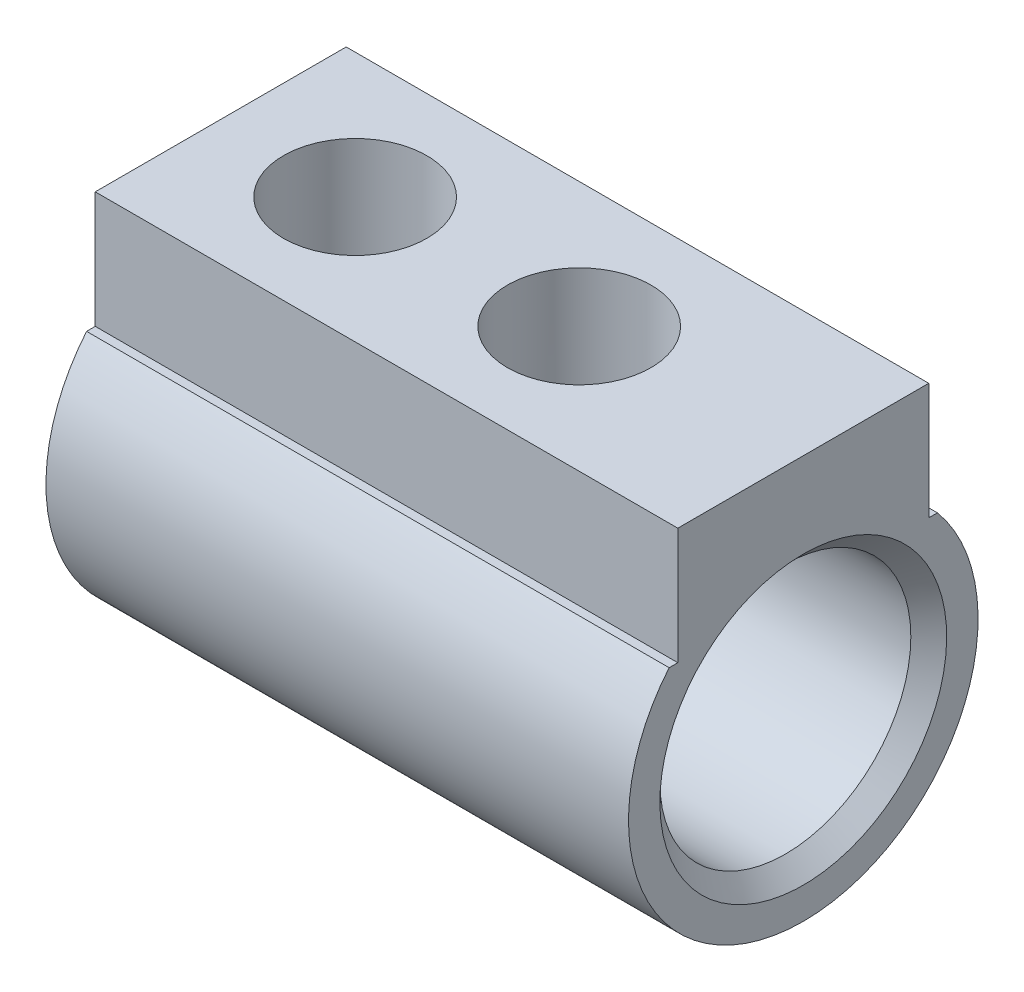
ISO-10303-21;
HEADER;
FILE_DESCRIPTION(('STEP AP214'),'2;1');
FILE_NAME('part.step','',(''),(''),'','','');
FILE_SCHEMA(('AUTOMOTIVE_DESIGN { 1 0 10303 214 1 1 1 1 }'));
ENDSEC;
DATA;
#1=APPLICATION_CONTEXT('core data for automotive mechanical design processes');
#2=APPLICATION_PROTOCOL_DEFINITION('international standard','automotive_design',2000,#1);
#3=PRODUCT_CONTEXT('',#1,'mechanical');
#4=PRODUCT('Part','Part','',(#3));
#5=PRODUCT_RELATED_PRODUCT_CATEGORY('part','',(#4));
#6=PRODUCT_DEFINITION_FORMATION('','',#4);
#7=PRODUCT_DEFINITION_CONTEXT('part definition',#1,'design');
#8=PRODUCT_DEFINITION('design','',#6,#7);
#9=PRODUCT_DEFINITION_SHAPE('','',#8);
#10=(LENGTH_UNIT() NAMED_UNIT(*) SI_UNIT(.MILLI.,.METRE.));
#11=(NAMED_UNIT(*) PLANE_ANGLE_UNIT() SI_UNIT($,.RADIAN.));
#12=(NAMED_UNIT(*) SI_UNIT($,.STERADIAN.) SOLID_ANGLE_UNIT());
#13=UNCERTAINTY_MEASURE_WITH_UNIT(LENGTH_MEASURE(1.E-05),#10,'distance_accuracy_value','');
#14=(GEOMETRIC_REPRESENTATION_CONTEXT(3) GLOBAL_UNCERTAINTY_ASSIGNED_CONTEXT((#13)) GLOBAL_UNIT_ASSIGNED_CONTEXT((#10,
#11,#12)) REPRESENTATION_CONTEXT('',''));
#15=CARTESIAN_POINT('',(0.,0.,0.));
#16=DIRECTION('',(0.,0.,1.));
#17=DIRECTION('',(1.,0.,0.));
#18=AXIS2_PLACEMENT_3D('',#15,#16,#17);
#19=CARTESIAN_POINT('',(2.5,0.,0.));
#20=DIRECTION('',(1.,0.,0.));
#21=DIRECTION('',(0.,0.,-1.));
#22=AXIS2_PLACEMENT_3D('',#19,#20,#21);
#23=PLANE('',#22);
#24=CARTESIAN_POINT('',(2.5,0.,0.));
#25=DIRECTION('',(-1.,0.,0.));
#26=DIRECTION('',(0.,0.,1.));
#27=AXIS2_PLACEMENT_3D('',#24,#25,#26);
#28=CIRCLE('',#27,1.2);
#29=CARTESIAN_POINT('',(2.5,0.,-1.2));
#30=VERTEX_POINT('',#29);
#31=CARTESIAN_POINT('',(2.5,0.,1.2));
#32=VERTEX_POINT('',#31);
#33=EDGE_CURVE('E84',#30,#32,#28,.F.);
#34=ORIENTED_EDGE('',*,*,#33,.T.);
#35=CARTESIAN_POINT('',(2.5,0.,0.));
#36=DIRECTION('',(-1.,0.,0.));
#37=DIRECTION('',(0.,0.,-1.));
#38=AXIS2_PLACEMENT_3D('',#35,#36,#37);
#39=CIRCLE('',#38,1.2);
#40=EDGE_CURVE('E81',#32,#30,#39,.F.);
#41=ORIENTED_EDGE('',*,*,#40,.T.);
#42=EDGE_LOOP('',(#34,#41));
#43=FACE_BOUND('',#42,.T.);
#44=ADVANCED_FACE('F16',(#43),#23,.T.);
#45=CARTESIAN_POINT('',(2.70000000000003,0.,0.));
#46=DIRECTION('',(-1.,0.,0.));
#47=DIRECTION('',(0.,0.,1.));
#48=AXIS2_PLACEMENT_3D('',#45,#46,#47);
#49=TOROIDAL_SURFACE('',#48,1.19999999999997,0.200000000000032);
#50=CARTESIAN_POINT('',(2.7,0.,0.));
#51=DIRECTION('',(-1.,0.,0.));
#52=DIRECTION('',(0.,0.,1.));
#53=AXIS2_PLACEMENT_3D('',#50,#51,#52);
#54=CIRCLE('',#53,1.4);
#55=CARTESIAN_POINT('',(2.7,0.,1.4));
#56=VERTEX_POINT('',#55);
#57=EDGE_CURVE('E88',#56,#56,#54,.F.);
#58=ORIENTED_EDGE('',*,*,#57,.T.);
#59=EDGE_LOOP('',(#58));
#60=FACE_BOUND('',#59,.T.);
#61=ORIENTED_EDGE('',*,*,#40,.F.);
#62=ORIENTED_EDGE('',*,*,#33,.F.);
#63=EDGE_LOOP('',(#61,#62));
#64=FACE_BOUND('',#63,.T.);
#65=ADVANCED_FACE('F91',(#60,#64),#49,.F.);
#66=CARTESIAN_POINT('',(6.5,0.,0.));
#67=DIRECTION('',(-1.,0.,0.));
#68=DIRECTION('',(0.,0.,1.));
#69=AXIS2_PLACEMENT_3D('',#66,#67,#68);
#70=CYLINDRICAL_SURFACE('',#69,1.4);
#71=CARTESIAN_POINT('',(6.30000000006703,0.,0.));
#72=DIRECTION('',(1.,0.,0.));
#73=DIRECTION('',(0.,0.,-1.));
#74=AXIS2_PLACEMENT_3D('',#71,#72,#73);
#75=CIRCLE('',#74,1.39999999993279);
#76=CARTESIAN_POINT('',(6.30000000006703,0.,-1.39999999993279));
#77=VERTEX_POINT('',#76);
#78=EDGE_CURVE('E184',#77,#77,#75,.T.);
#79=ORIENTED_EDGE('',*,*,#78,.T.);
#80=EDGE_LOOP('',(#79));
#81=FACE_BOUND('',#80,.T.);
#82=CARTESIAN_POINT('',(4.,1.14891252930761,0.799999999999994));
#83=CARTESIAN_POINT('',(4.04069824257391,1.14891484577563,0.799998460221337));
#84=CARTESIAN_POINT('',(4.08140806043848,1.15110830521368,0.796874222358561));
#85=CARTESIAN_POINT('',(4.16149049705016,1.15951924830011,0.784580899012323));
#86=CARTESIAN_POINT('',(4.20086149011939,1.16574145227915,0.775404722461637));
#87=CARTESIAN_POINT('',(4.27695138583307,1.18123642159114,0.751584111633495));
#88=CARTESIAN_POINT('',(4.31368579621984,1.19048919396833,0.736975432821264));
#89=CARTESIAN_POINT('',(4.38416684446136,1.21096834505556,0.70281680682157));
#90=CARTESIAN_POINT('',(4.4179125539945,1.22219533376744,0.68326533156804));
#91=CARTESIAN_POINT('',(4.48552773454469,1.2468517275537,0.637270069169196));
#92=CARTESIAN_POINT('',(4.51900405412647,1.26038760849784,0.610305254923101));
#93=CARTESIAN_POINT('',(4.58127919704216,1.28728254963199,0.551321521850115));
#94=CARTESIAN_POINT('',(4.61007497979492,1.30064148974336,0.519299344063282));
#95=CARTESIAN_POINT('',(4.66486681857898,1.32718495238073,0.447416658839746));
#96=CARTESIAN_POINT('',(4.69033814634315,1.34023271058415,0.407100750117686));
#97=CARTESIAN_POINT('',(4.73395233092827,1.36321016187439,0.32186882754837));
#98=CARTESIAN_POINT('',(4.7521012386676,1.37314242794682,0.276956650488885));
#99=CARTESIAN_POINT('',(4.77885523829167,1.38798534454052,0.188006517665602));
#100=CARTESIAN_POINT('',(4.78816225404409,1.39326232890506,0.14424233472889));
#101=CARTESIAN_POINT('',(4.79932280103676,1.39960515858208,0.05548549756934));
#102=CARTESIAN_POINT('',(4.80118251388847,1.40067449642611,0.0104938934121116));
#103=CARTESIAN_POINT('',(4.79756523928601,1.39861004047328,-0.0739788056378351));
#104=CARTESIAN_POINT('',(4.79289209299124,1.3959367103426,-0.113509070937489));
#105=CARTESIAN_POINT('',(4.77784217937567,1.38744363636413,-0.191111751803173));
#106=CARTESIAN_POINT('',(4.7674649982232,1.38162366422579,-0.229184061379111));
#107=CARTESIAN_POINT('',(4.74133959140838,1.36728362549718,-0.30327143515931));
#108=CARTESIAN_POINT('',(4.72554447461413,1.35874003371766,-0.339265221191029));
#109=CARTESIAN_POINT('',(4.68915281796566,1.33966105396097,-0.408151377018276));
#110=CARTESIAN_POINT('',(4.66855487179815,1.3291250827676,-0.441042834453448));
#111=CARTESIAN_POINT('',(4.62050207947206,1.30557843194866,-0.506771084917169));
#112=CARTESIAN_POINT('',(4.59253536111841,1.29242264164193,-0.539181513640782));
#113=CARTESIAN_POINT('',(4.53186716749769,1.26575660386133,-0.599115002810966));
#114=CARTESIAN_POINT('',(4.49915979934393,1.25224593262172,-0.626631884086079));
#115=CARTESIAN_POINT('',(4.42604334088809,1.22484715250961,-0.678748311801367));
#116=CARTESIAN_POINT('',(4.38519143329233,1.21105584767092,-0.702782981736945));
#117=CARTESIAN_POINT('',(4.29915613703159,1.18651199116607,-0.743477175319416));
#118=CARTESIAN_POINT('',(4.25398174104994,1.17575330682022,-0.760151622324447));
#119=CARTESIAN_POINT('',(4.17381716778247,1.1615192404806,-0.78165754759861));
#120=CARTESIAN_POINT('',(4.13957666950964,1.15684327359221,-0.788507290996708));
#121=CARTESIAN_POINT('',(4.07022657851125,1.15053996382207,-0.797677628661532));
#122=CARTESIAN_POINT('',(4.03511759849099,1.14891053047944,-0.800001328640378));
#123=CARTESIAN_POINT('',(3.95930175742609,1.14891484577563,-0.799998460221337));
#124=CARTESIAN_POINT('',(3.91859193956152,1.15110830521368,-0.796874222358561));
#125=CARTESIAN_POINT('',(3.83850950294984,1.15951924830011,-0.784580899012323));
#126=CARTESIAN_POINT('',(3.79913850988061,1.16574145227915,-0.775404722461637));
#127=CARTESIAN_POINT('',(3.72304861416693,1.18123642159114,-0.751584111633495));
#128=CARTESIAN_POINT('',(3.68631420378017,1.19048919396833,-0.736975432821264));
#129=CARTESIAN_POINT('',(3.61583315553864,1.21096834505556,-0.70281680682157));
#130=CARTESIAN_POINT('',(3.5820874460055,1.22219533376744,-0.683265331568039));
#131=CARTESIAN_POINT('',(3.51447226545531,1.2468517275537,-0.637270069169196));
#132=CARTESIAN_POINT('',(3.48099594587353,1.26038760849784,-0.6103052549231));
#133=CARTESIAN_POINT('',(3.41872080295784,1.28728254963199,-0.551321521850115));
#134=CARTESIAN_POINT('',(3.38992502020508,1.30064148974336,-0.519299344063281));
#135=CARTESIAN_POINT('',(3.33513318142102,1.32718495238073,-0.447416658839745));
#136=CARTESIAN_POINT('',(3.30966185365685,1.34023271058415,-0.407100750117685));
#137=CARTESIAN_POINT('',(3.26604766907173,1.36321016187439,-0.321868827548369));
#138=CARTESIAN_POINT('',(3.2478987613324,1.37314242794682,-0.276956650488884));
#139=CARTESIAN_POINT('',(3.22114476170833,1.38798534454052,-0.188006517665601));
#140=CARTESIAN_POINT('',(3.21183774595591,1.39326232890506,-0.144242334728889));
#141=CARTESIAN_POINT('',(3.20067719896324,1.39960515858208,-0.0554854975693392));
#142=CARTESIAN_POINT('',(3.19881748611153,1.40067449642611,-0.0104938934121107));
#143=CARTESIAN_POINT('',(3.20243476071399,1.39861004047328,0.0739788056378359));
#144=CARTESIAN_POINT('',(3.20710790700876,1.3959367103426,0.11350907093749));
#145=CARTESIAN_POINT('',(3.22215782062433,1.38744363636413,0.191111751803174));
#146=CARTESIAN_POINT('',(3.2325350017768,1.38162366422578,0.229184061379111));
#147=CARTESIAN_POINT('',(3.25866040859162,1.36728362549718,0.30327143515931));
#148=CARTESIAN_POINT('',(3.27445552538587,1.35874003371766,0.33926522119103));
#149=CARTESIAN_POINT('',(3.31084718203434,1.33966105396097,0.408151377018276));
#150=CARTESIAN_POINT('',(3.33144512820185,1.3291250827676,0.441042834453448));
#151=CARTESIAN_POINT('',(3.37949792052794,1.30557843194866,0.50677108491717));
#152=CARTESIAN_POINT('',(3.40746463888159,1.29242264164193,0.539181513640783));
#153=CARTESIAN_POINT('',(3.46813283250231,1.26575660386133,0.599115002810966));
#154=CARTESIAN_POINT('',(3.50084020065607,1.25224593262172,0.626631884086079));
#155=CARTESIAN_POINT('',(3.57395665911191,1.22484715250961,0.678748311801367));
#156=CARTESIAN_POINT('',(3.61480856670767,1.21105584767092,0.702782981736945));
#157=CARTESIAN_POINT('',(3.70084386296842,1.18651199116607,0.743477175319416));
#158=CARTESIAN_POINT('',(3.74601825895007,1.17575330682022,0.760151622324447));
#159=CARTESIAN_POINT('',(3.82618283221753,1.1615192404806,0.78165754759861));
#160=CARTESIAN_POINT('',(3.86042333049037,1.15684327359221,0.788507290996708));
#161=CARTESIAN_POINT('',(3.92977342148875,1.15053996382207,0.797677628661532));
#162=CARTESIAN_POINT('',(3.96488240150901,1.14891053047944,0.800001328640378));
#163=CARTESIAN_POINT('',(4.,1.14891252930761,0.799999999999994));
#164=B_SPLINE_CURVE_WITH_KNOTS('',3,(#82,#83,#84,#85,#86,#87,#88,#89,#90,#91,#92,#93,#94,#95,
#96,#97,#98,#99,#100,#101,#102,#103,#104,#105,#106,#107,#108,#109,#110,#111,#112,#113,#114,#115,
#116,#117,#118,#119,#120,#121,#122,#123,#124,#125,#126,#127,#128,#129,#130,#131,#132,#133,#134,
#135,#136,#137,#138,#139,#140,#141,#142,#143,#144,#145,#146,#147,#148,#149,#150,#151,#152,#153,
#154,#155,#156,#157,#158,#159,#160,#161,#162,#163),.UNSPECIFIED.,.T.,.F.,(4,2,2,2,2,2,2,2,2,2,2,
2,2,2,2,2,2,2,2,2,2,2,2,2,2,2,2,2,2,2,2,2,2,2,2,2,2,2,2,2,4),(0.,0.121947032681082,
0.244037205368826,0.365337635694194,0.486675612016515,0.621334846550715,0.756081212102016,
0.903610101472166,1.05101682867798,1.18539102635755,1.31965366398909,1.43877295021829,
1.55790087977469,1.67808699936866,1.79830835487185,1.93211787327119,2.06609517387942,
2.21343794791426,2.36048058646242,2.46577821856092,2.57100357130399,2.69295060398507,
2.81504077667282,2.93634120699819,3.05767918332051,3.19233841785471,3.32708478340601,
3.47461367277616,3.62202039998198,3.75639459766154,3.89065723529308,4.00977652152228,
4.12890445107868,4.24909057067265,4.36931192617584,4.50312144457518,4.63709874518342,
4.78444151921825,4.93148415776642,5.03678178986492,5.14200714260798),.UNSPECIFIED.);
#165=CARTESIAN_POINT('',(4.,1.14891252930761,0.799999999999994));
#166=VERTEX_POINT('',#165);
#167=EDGE_CURVE('E93',#166,#166,#164,.T.);
#168=ORIENTED_EDGE('',*,*,#167,.T.);
#169=EDGE_LOOP('',(#168));
#170=FACE_BOUND('',#169,.T.);
#171=ORIENTED_EDGE('',*,*,#57,.F.);
#172=EDGE_LOOP('',(#171));
#173=FACE_BOUND('',#172,.T.);
#174=ADVANCED_FACE('F104',(#81,#170,#173),#70,.F.);
#175=CARTESIAN_POINT('',(4.,2.55,0.));
#176=DIRECTION('',(0.,1.,0.));
#177=DIRECTION('',(0.,0.,1.));
#178=AXIS2_PLACEMENT_3D('',#175,#176,#177);
#179=CYLINDRICAL_SURFACE('',#178,0.799999999999994);
#180=ORIENTED_EDGE('',*,*,#167,.F.);
#181=EDGE_LOOP('',(#180));
#182=FACE_BOUND('',#181,.T.);
#183=CARTESIAN_POINT('',(4.,2.55,0.));
#184=DIRECTION('',(0.,1.,0.));
#185=DIRECTION('',(0.,0.,1.));
#186=AXIS2_PLACEMENT_3D('',#183,#184,#185);
#187=CIRCLE('',#186,0.799999999999994);
#188=CARTESIAN_POINT('',(4.,2.55,0.799999999999994));
#189=VERTEX_POINT('',#188);
#190=EDGE_CURVE('E102',#189,#189,#187,.T.);
#191=ORIENTED_EDGE('',*,*,#190,.T.);
#192=EDGE_LOOP('',(#191));
#193=FACE_BOUND('',#192,.T.);
#194=ADVANCED_FACE('F106',(#182,#193),#179,.F.);
#195=CARTESIAN_POINT('',(6.5,1.25,-1.4));
#196=DIRECTION('',(0.,0.,1.));
#197=DIRECTION('',(1.,0.,0.));
#198=AXIS2_PLACEMENT_3D('',#195,#196,#197);
#199=PLANE('',#198);
#200=DIRECTION('',(1.,0.,0.));
#201=VECTOR('',#200,1.);
#202=CARTESIAN_POINT('',(6.5,2.55,-1.4));
#203=LINE('',#202,#201);
#204=CARTESIAN_POINT('',(0.,2.55,-1.4));
#205=VERTEX_POINT('',#204);
#206=CARTESIAN_POINT('',(6.5,2.55,-1.4));
#207=VERTEX_POINT('',#206);
#208=EDGE_CURVE('E218',#205,#207,#203,.T.);
#209=ORIENTED_EDGE('',*,*,#208,.T.);
#210=DIRECTION('',(0.,1.,0.));
#211=VECTOR('',#210,1.);
#212=CARTESIAN_POINT('',(6.5,1.25,-1.4));
#213=LINE('',#212,#211);
#214=CARTESIAN_POINT('',(6.5,1.25,-1.4));
#215=VERTEX_POINT('',#214);
#216=EDGE_CURVE('E101',#215,#207,#213,.T.);
#217=ORIENTED_EDGE('',*,*,#216,.F.);
#218=DIRECTION('',(1.,0.,0.));
#219=VECTOR('',#218,1.);
#220=CARTESIAN_POINT('',(6.5,1.25,-1.4));
#221=LINE('',#220,#219);
#222=CARTESIAN_POINT('',(0.,1.25,-1.4));
#223=VERTEX_POINT('',#222);
#224=EDGE_CURVE('E189',#215,#223,#221,.F.);
#225=ORIENTED_EDGE('',*,*,#224,.T.);
#226=DIRECTION('',(0.,1.,0.));
#227=VECTOR('',#226,1.);
#228=CARTESIAN_POINT('',(0.,1.25,-1.4));
#229=LINE('',#228,#227);
#230=EDGE_CURVE('E201',#205,#223,#229,.F.);
#231=ORIENTED_EDGE('',*,*,#230,.F.);
#232=EDGE_LOOP('',(#209,#217,#225,#231));
#233=FACE_BOUND('',#232,.T.);
#234=ADVANCED_FACE('F110',(#233),#199,.F.);
#235=CARTESIAN_POINT('',(6.5,2.55,1.4));
#236=DIRECTION('',(0.,0.,-1.));
#237=DIRECTION('',(-1.,0.,0.));
#238=AXIS2_PLACEMENT_3D('',#235,#236,#237);
#239=PLANE('',#238);
#240=DIRECTION('',(1.,0.,0.));
#241=VECTOR('',#240,1.);
#242=CARTESIAN_POINT('',(6.5,1.25,1.4));
#243=LINE('',#242,#241);
#244=CARTESIAN_POINT('',(0.,1.25,1.4));
#245=VERTEX_POINT('',#244);
#246=CARTESIAN_POINT('',(6.5,1.25,1.4));
#247=VERTEX_POINT('',#246);
#248=EDGE_CURVE('E180',#245,#247,#243,.T.);
#249=ORIENTED_EDGE('',*,*,#248,.T.);
#250=DIRECTION('',(0.,1.,0.));
#251=VECTOR('',#250,1.);
#252=CARTESIAN_POINT('',(6.5,2.55,1.4));
#253=LINE('',#252,#251);
#254=CARTESIAN_POINT('',(6.5,2.55,1.4));
#255=VERTEX_POINT('',#254);
#256=EDGE_CURVE('E60',#255,#247,#253,.F.);
#257=ORIENTED_EDGE('',*,*,#256,.F.);
#258=DIRECTION('',(1.,0.,0.));
#259=VECTOR('',#258,1.);
#260=CARTESIAN_POINT('',(6.5,2.55,1.4));
#261=LINE('',#260,#259);
#262=CARTESIAN_POINT('',(0.,2.55,1.4));
#263=VERTEX_POINT('',#262);
#264=EDGE_CURVE('E177',#255,#263,#261,.F.);
#265=ORIENTED_EDGE('',*,*,#264,.T.);
#266=DIRECTION('',(0.,1.,0.));
#267=VECTOR('',#266,1.);
#268=CARTESIAN_POINT('',(0.,2.55,1.4));
#269=LINE('',#268,#267);
#270=EDGE_CURVE('E194',#245,#263,#269,.T.);
#271=ORIENTED_EDGE('',*,*,#270,.F.);
#272=EDGE_LOOP('',(#249,#257,#265,#271));
#273=FACE_BOUND('',#272,.T.);
#274=ADVANCED_FACE('F114',(#273),#239,.F.);
#275=CARTESIAN_POINT('',(6.5,1.25,-1.4966629547096));
#276=DIRECTION('',(0.,-1.,0.));
#277=DIRECTION('',(0.,0.,-1.));
#278=AXIS2_PLACEMENT_3D('',#275,#276,#277);
#279=PLANE('',#278);
#280=ORIENTED_EDGE('',*,*,#224,.F.);
#281=DIRECTION('',(0.,0.,-1.));
#282=VECTOR('',#281,1.);
#283=CARTESIAN_POINT('',(6.5,1.25,-1.4966629547096));
#284=LINE('',#283,#282);
#285=CARTESIAN_POINT('',(6.5,1.25,-1.4966629547096));
#286=VERTEX_POINT('',#285);
#287=EDGE_CURVE('E192',#286,#215,#284,.F.);
#288=ORIENTED_EDGE('',*,*,#287,.F.);
#289=DIRECTION('',(-1.,0.,0.));
#290=VECTOR('',#289,1.);
#291=CARTESIAN_POINT('',(6.5,1.25,-1.4966629547096));
#292=LINE('',#291,#290);
#293=CARTESIAN_POINT('',(0.,1.25,-1.4966629547096));
#294=VERTEX_POINT('',#293);
#295=EDGE_CURVE('E171',#294,#286,#292,.F.);
#296=ORIENTED_EDGE('',*,*,#295,.F.);
#297=DIRECTION('',(0.,0.,-1.));
#298=VECTOR('',#297,1.);
#299=CARTESIAN_POINT('',(0.,1.25,-1.4966629547096));
#300=LINE('',#299,#298);
#301=EDGE_CURVE('E187',#223,#294,#300,.T.);
#302=ORIENTED_EDGE('',*,*,#301,.F.);
#303=EDGE_LOOP('',(#280,#288,#296,#302));
#304=FACE_BOUND('',#303,.T.);
#305=ADVANCED_FACE('F118',(#304),#279,.F.);
#306=CARTESIAN_POINT('',(6.50000000001683,0.,0.));
#307=DIRECTION('',(1.,0.,0.));
#308=DIRECTION('',(0.,1.,0.));
#309=AXIS2_PLACEMENT_3D('',#306,#307,#308);
#310=CONICAL_SURFACE('',#309,1.59999999988258,0.78539816325534);
#311=ORIENTED_EDGE('',*,*,#78,.F.);
#312=EDGE_LOOP('',(#311));
#313=FACE_BOUND('',#312,.T.);
#314=CARTESIAN_POINT('',(6.50000000007367,0.,0.));
#315=DIRECTION('',(1.,0.,0.));
#316=DIRECTION('',(0.,1.,0.));
#317=AXIS2_PLACEMENT_3D('',#314,#315,#316);
#318=CIRCLE('',#317,1.59999999993943);
#319=CARTESIAN_POINT('',(6.50000000007367,1.59999999993943,0.));
#320=VERTEX_POINT('',#319);
#321=EDGE_CURVE('E161',#320,#320,#318,.F.);
#322=ORIENTED_EDGE('',*,*,#321,.F.);
#323=EDGE_LOOP('',(#322));
#324=FACE_BOUND('',#323,.T.);
#325=ADVANCED_FACE('F122',(#313,#324),#310,.F.);
#326=CARTESIAN_POINT('',(6.5,1.25,1.4));
#327=DIRECTION('',(0.,-1.,0.));
#328=DIRECTION('',(0.,0.,-1.));
#329=AXIS2_PLACEMENT_3D('',#326,#327,#328);
#330=PLANE('',#329);
#331=DIRECTION('',(-1.,0.,0.));
#332=VECTOR('',#331,1.);
#333=CARTESIAN_POINT('',(6.5,1.25,1.4966629547096));
#334=LINE('',#333,#332);
#335=CARTESIAN_POINT('',(6.5,1.25,1.4966629547096));
#336=VERTEX_POINT('',#335);
#337=CARTESIAN_POINT('',(0.,1.25,1.4966629547096));
#338=VERTEX_POINT('',#337);
#339=EDGE_CURVE('E163',#336,#338,#334,.T.);
#340=ORIENTED_EDGE('',*,*,#339,.F.);
#341=DIRECTION('',(0.,0.,-1.));
#342=VECTOR('',#341,1.);
#343=CARTESIAN_POINT('',(6.5,1.25,0.));
#344=LINE('',#343,#342);
#345=EDGE_CURVE('E164',#247,#336,#344,.F.);
#346=ORIENTED_EDGE('',*,*,#345,.F.);
#347=ORIENTED_EDGE('',*,*,#248,.F.);
#348=DIRECTION('',(0.,0.,-1.));
#349=VECTOR('',#348,1.);
#350=CARTESIAN_POINT('',(0.,1.25,1.4));
#351=LINE('',#350,#349);
#352=EDGE_CURVE('E178',#338,#245,#351,.T.);
#353=ORIENTED_EDGE('',*,*,#352,.F.);
#354=EDGE_LOOP('',(#340,#346,#347,#353));
#355=FACE_BOUND('',#354,.T.);
#356=ADVANCED_FACE('F126',(#355),#330,.F.);
#357=CARTESIAN_POINT('',(6.5,2.55,-1.4));
#358=DIRECTION('',(0.,-1.,0.));
#359=DIRECTION('',(0.,0.,-1.));
#360=AXIS2_PLACEMENT_3D('',#357,#358,#359);
#361=PLANE('',#360);
#362=ORIENTED_EDGE('',*,*,#264,.F.);
#363=DIRECTION('',(0.,0.,-1.));
#364=VECTOR('',#363,1.);
#365=CARTESIAN_POINT('',(6.5,2.55,0.));
#366=LINE('',#365,#364);
#367=EDGE_CURVE('E167',#207,#255,#366,.F.);
#368=ORIENTED_EDGE('',*,*,#367,.F.);
#369=ORIENTED_EDGE('',*,*,#208,.F.);
#370=DIRECTION('',(0.,0.,-1.));
#371=VECTOR('',#370,1.);
#372=CARTESIAN_POINT('',(0.,2.55,0.));
#373=LINE('',#372,#371);
#374=EDGE_CURVE('E160',#205,#263,#373,.F.);
#375=ORIENTED_EDGE('',*,*,#374,.T.);
#376=EDGE_LOOP('',(#362,#368,#369,#375));
#377=FACE_BOUND('',#376,.T.);
#378=CARTESIAN_POINT('',(1.5,2.55,0.));
#379=DIRECTION('',(0.,1.,0.));
#380=DIRECTION('',(0.,0.,1.));
#381=AXIS2_PLACEMENT_3D('',#378,#379,#380);
#382=CIRCLE('',#381,0.799999999999994);
#383=CARTESIAN_POINT('',(1.5,2.55,0.799999999999994));
#384=VERTEX_POINT('',#383);
#385=EDGE_CURVE('E158',#384,#384,#382,.F.);
#386=ORIENTED_EDGE('',*,*,#385,.T.);
#387=EDGE_LOOP('',(#386));
#388=FACE_BOUND('',#387,.T.);
#389=ORIENTED_EDGE('',*,*,#190,.F.);
#390=EDGE_LOOP('',(#389));
#391=FACE_BOUND('',#390,.T.);
#392=ADVANCED_FACE('F130',(#377,#388,#391),#361,.F.);
#393=CARTESIAN_POINT('',(6.5,0.,0.));
#394=DIRECTION('',(1.,0.,0.));
#395=DIRECTION('',(0.,0.,-1.));
#396=AXIS2_PLACEMENT_3D('',#393,#394,#395);
#397=PLANE('',#396);
#398=ORIENTED_EDGE('',*,*,#321,.T.);
#399=EDGE_LOOP('',(#398));
#400=FACE_BOUND('',#399,.T.);
#401=ORIENTED_EDGE('',*,*,#256,.T.);
#402=ORIENTED_EDGE('',*,*,#345,.T.);
#403=CARTESIAN_POINT('',(6.5,0.,0.));
#404=DIRECTION('',(-1.,0.,0.));
#405=DIRECTION('',(0.,0.,1.));
#406=AXIS2_PLACEMENT_3D('',#403,#404,#405);
#407=CIRCLE('',#406,1.95000000000001);
#408=EDGE_CURVE('E52',#286,#336,#407,.T.);
#409=ORIENTED_EDGE('',*,*,#408,.F.);
#410=ORIENTED_EDGE('',*,*,#287,.T.);
#411=ORIENTED_EDGE('',*,*,#216,.T.);
#412=ORIENTED_EDGE('',*,*,#367,.T.);
#413=EDGE_LOOP('',(#401,#402,#409,#410,#411,#412));
#414=FACE_BOUND('',#413,.T.);
#415=ADVANCED_FACE('F134',(#400,#414),#397,.T.);
#416=CARTESIAN_POINT('',(0.,0.,0.));
#417=DIRECTION('',(1.,0.,0.));
#418=DIRECTION('',(0.,0.,-1.));
#419=AXIS2_PLACEMENT_3D('',#416,#417,#418);
#420=PLANE('',#419);
#421=ORIENTED_EDGE('',*,*,#352,.T.);
#422=ORIENTED_EDGE('',*,*,#270,.T.);
#423=ORIENTED_EDGE('',*,*,#374,.F.);
#424=ORIENTED_EDGE('',*,*,#230,.T.);
#425=ORIENTED_EDGE('',*,*,#301,.T.);
#426=CARTESIAN_POINT('',(0.,0.,0.));
#427=DIRECTION('',(-1.,0.,0.));
#428=DIRECTION('',(0.,0.,1.));
#429=AXIS2_PLACEMENT_3D('',#426,#427,#428);
#430=CIRCLE('',#429,1.95000000000001);
#431=EDGE_CURVE('E27',#338,#294,#430,.F.);
#432=ORIENTED_EDGE('',*,*,#431,.F.);
#433=EDGE_LOOP('',(#421,#422,#423,#424,#425,#432));
#434=FACE_BOUND('',#433,.T.);
#435=ADVANCED_FACE('F138',(#434),#420,.F.);
#436=CARTESIAN_POINT('',(1.5,2.55,0.));
#437=DIRECTION('',(0.,1.,0.));
#438=DIRECTION('',(0.,0.,1.));
#439=AXIS2_PLACEMENT_3D('',#436,#437,#438);
#440=CYLINDRICAL_SURFACE('',#439,0.799999999999994);
#441=ORIENTED_EDGE('',*,*,#385,.F.);
#442=EDGE_LOOP('',(#441));
#443=FACE_BOUND('',#442,.T.);
#444=CARTESIAN_POINT('',(1.49999999999952,-1.77834192437788,0.799999999999994));
#445=CARTESIAN_POINT('',(1.54278434066471,-1.77834468559484,0.799997347966624));
#446=CARTESIAN_POINT('',(1.58560576116806,-1.77990648383502,0.796549855364519));
#447=CARTESIAN_POINT('',(1.66997988924312,-1.7859488133926,0.782904477605014));
#448=CARTESIAN_POINT('',(1.71153061676699,-1.7904336788792,0.772696568096674));
#449=CARTESIAN_POINT('',(1.79204644160139,-1.80172303373258,0.745990419895769));
#450=CARTESIAN_POINT('',(1.83102007561198,-1.80851935358356,0.72951431128774));
#451=CARTESIAN_POINT('',(1.90565244629571,-1.8236544315319,0.690807340908591));
#452=CARTESIAN_POINT('',(1.94131095144454,-1.83199329723725,0.668576077614629));
#453=CARTESIAN_POINT('',(2.01045203729832,-1.84983362858024,0.617562477572966));
#454=CARTESIAN_POINT('',(2.0437099628647,-1.85937369377611,0.588489035874305));
#455=CARTESIAN_POINT('',(2.10504143764398,-1.87822309818955,0.525230058072547));
#456=CARTESIAN_POINT('',(2.13311341963948,-1.88753236692582,0.491042982234452));
#457=CARTESIAN_POINT('',(2.18441549988596,-1.90534007929139,0.416768044791707));
#458=CARTESIAN_POINT('',(2.20739374957458,-1.91378827441062,0.376493090260619));
#459=CARTESIAN_POINT('',(2.24615232783668,-1.92845016181551,0.292239892980412));
#460=CARTESIAN_POINT('',(2.26193566405011,-1.93466478755445,0.248263206764783));
#461=CARTESIAN_POINT('',(2.28504494675407,-1.94388503320455,0.160217619180366));
#462=CARTESIAN_POINT('',(2.29275871142651,-1.94703722442635,0.116266169051578));
#463=CARTESIAN_POINT('',(2.30076135662829,-1.95030882232469,0.0275872081788018));
#464=CARTESIAN_POINT('',(2.30105314496019,-1.95042941672846,-0.017139991766834));
#465=CARTESIAN_POINT('',(2.29441038453667,-1.94771163578851,-0.103287697416572));
#466=CARTESIAN_POINT('',(2.28790142407533,-1.94504752228333,-0.144747534091999));
#467=CARTESIAN_POINT('',(2.26856927329937,-1.93729726301786,-0.225926134107314));
#468=CARTESIAN_POINT('',(2.25574561925555,-1.93221093937975,-0.265644769346081));
#469=CARTESIAN_POINT('',(2.22399314376312,-1.92001267552108,-0.342938516112574));
#470=CARTESIAN_POINT('',(2.20497437369938,-1.91287108413079,-0.38047180330399));
#471=CARTESIAN_POINT('',(2.16145872927881,-1.89726532098806,-0.451910666442758));
#472=CARTESIAN_POINT('',(2.1369601325812,-1.88880073366299,-0.485815096855276));
#473=CARTESIAN_POINT('',(2.08122691343541,-1.87071741286178,-0.55150281310195));
#474=CARTESIAN_POINT('',(2.0496458255933,-1.86105933833608,-0.58298171012588));
#475=CARTESIAN_POINT('',(1.98161459978333,-1.84211471531195,-0.640334249013311));
#476=CARTESIAN_POINT('',(1.94516140698571,-1.83282840469729,-0.666204347232557));
#477=CARTESIAN_POINT('',(1.86697800507482,-1.81539980949877,-0.712357069565609));
#478=CARTESIAN_POINT('',(1.82511725948648,-1.80730305599859,-0.732436850554014));
#479=CARTESIAN_POINT('',(1.73822522785495,-1.79371828514385,-0.765109568639837));
#480=CARTESIAN_POINT('',(1.69320104732097,-1.78822462322068,-0.777718720136864));
#481=CARTESIAN_POINT('',(1.62310162339009,-1.78243246314629,-0.790857940577565));
#482=CARTESIAN_POINT('',(1.59863629781591,-1.78090574989511,-0.794280180815846));
#483=CARTESIAN_POINT('',(1.5494514425436,-1.7788596895653,-0.798851960960791));
#484=CARTESIAN_POINT('',(1.52473191644836,-1.77834032822876,-0.800001533034448));
#485=CARTESIAN_POINT('',(1.4572156593348,-1.77834468559485,-0.799997347966599));
#486=CARTESIAN_POINT('',(1.41439423883145,-1.77990648383504,-0.796549855364467));
#487=CARTESIAN_POINT('',(1.33002011075639,-1.78594881339264,-0.782904477604908));
#488=CARTESIAN_POINT('',(1.28846938323252,-1.79043367887926,-0.772696568096541));
#489=CARTESIAN_POINT('',(1.20795355839813,-1.80172303373265,-0.745990419895584));
#490=CARTESIAN_POINT('',(1.16897992438755,-1.80851935358365,-0.729514311287527));
#491=CARTESIAN_POINT('',(1.09434755370384,-1.823654431532,-0.690807340908327));
#492=CARTESIAN_POINT('',(1.05868904855502,-1.83199329723736,-0.668576077614339));
#493=CARTESIAN_POINT('',(0.989547962701268,-1.84983362858036,-0.617562477572624));
#494=CARTESIAN_POINT('',(0.956290037134896,-1.85937369377623,-0.588489035873935));
#495=CARTESIAN_POINT('',(0.894958562355653,-1.87822309818966,-0.525230058072125));
#496=CARTESIAN_POINT('',(0.866886580360173,-1.88753236692593,-0.491042982234004));
#497=CARTESIAN_POINT('',(0.815584500113739,-1.9053400792915,-0.416768044791215));
#498=CARTESIAN_POINT('',(0.792606250425146,-1.91378827441072,-0.37649309026011));
#499=CARTESIAN_POINT('',(0.753847672163106,-1.92845016181559,-0.292239892979874));
#500=CARTESIAN_POINT('',(0.738064335949707,-1.93466478755452,-0.248263206764233));
#501=CARTESIAN_POINT('',(0.714955053245816,-1.9438850332046,-0.160217619179806));
#502=CARTESIAN_POINT('',(0.707241288573412,-1.94703722442639,-0.116266169051019));
#503=CARTESIAN_POINT('',(0.699238643371686,-1.9503088223247,-0.0275872081782505));
#504=CARTESIAN_POINT('',(0.69894685503982,-1.95042941672845,0.0171399917673782));
#505=CARTESIAN_POINT('',(0.705589615463394,-1.94771163578848,0.103287697417102));
#506=CARTESIAN_POINT('',(0.71209857592477,-1.94504752228329,0.144747534092521));
#507=CARTESIAN_POINT('',(0.731430726700777,-1.9372972630178,0.225926134107817));
#508=CARTESIAN_POINT('',(0.744254380744619,-1.93221093937968,0.265644769346572));
#509=CARTESIAN_POINT('',(0.776006856237099,-1.920012675521,0.342938516113045));
#510=CARTESIAN_POINT('',(0.795025626300871,-1.9128710841307,0.380471803304451));
#511=CARTESIAN_POINT('',(0.838541270721488,-1.89726532098796,0.451910666443196));
#512=CARTESIAN_POINT('',(0.863039867419119,-1.88880073366288,0.485815096855701));
#513=CARTESIAN_POINT('',(0.918773086564966,-1.87071741286166,0.551502813102345));
#514=CARTESIAN_POINT('',(0.950354174407098,-1.86105933833596,0.582981710126257));
#515=CARTESIAN_POINT('',(1.01838540021712,-1.84211471531183,0.640334249013649));
#516=CARTESIAN_POINT('',(1.05483859301477,-1.83282840469717,0.666204347232874));
#517=CARTESIAN_POINT('',(1.1330219949257,-1.81539980949866,0.712357069565873));
#518=CARTESIAN_POINT('',(1.17488274051405,-1.80730305599849,0.732436850554248));
#519=CARTESIAN_POINT('',(1.2617747721456,-1.79371828514377,0.765109568640008));
#520=CARTESIAN_POINT('',(1.30679895267958,-1.78822462322062,0.777718720137003));
#521=CARTESIAN_POINT('',(1.3768983766103,-1.78243246314626,0.790857940577621));
#522=CARTESIAN_POINT('',(1.40136370218431,-1.7809057498951,0.794280180815868));
#523=CARTESIAN_POINT('',(1.45054855745627,-1.77885968956531,0.798851960960778));
#524=CARTESIAN_POINT('',(1.47526808355133,-1.77834032822877,0.800001533034433));
#525=CARTESIAN_POINT('',(1.49999999999952,-1.77834192437788,0.799999999999994));
#526=B_SPLINE_CURVE_WITH_KNOTS('',3,(#444,#445,#446,#447,#448,#449,#450,#451,#452,#453,#454,
#455,#456,#457,#458,#459,#460,#461,#462,#463,#464,#465,#466,#467,#468,#469,#470,#471,#472,#473,
#474,#475,#476,#477,#478,#479,#480,#481,#482,#483,#484,#485,#486,#487,#488,#489,#490,#491,#492,
#493,#494,#495,#496,#497,#498,#499,#500,#501,#502,#503,#504,#505,#506,#507,#508,#509,#510,#511,
#512,#513,#514,#515,#516,#517,#518,#519,#520,#521,#522,#523,#524,#525),.UNSPECIFIED.,.T.,.F.,(4,
2,2,2,2,2,2,2,2,2,2,2,2,2,2,2,2,2,2,2,2,2,2,2,2,2,2,2,2,2,2,2,2,2,2,2,2,2,2,2,4),(0.,
0.128255356300858,0.256701316812821,0.384697940868076,0.512703497337538,0.647688577704174,
0.782714384724617,0.923391957277382,1.06401066930897,1.19750822618542,1.33095348021164,
1.45652082326642,1.58209738892716,1.70958519797108,1.83711313360699,1.97337677699535,
2.10972626260543,2.25039281177882,2.39075292636375,2.46489326845465,2.53903256116715,
2.66728791746803,2.79573387798,2.92373050203527,3.05173605850475,3.18672113887141,
3.32174694589187,3.46242451844464,3.60304323047622,3.73654078735265,3.86998604137885,
3.99555338443362,4.12112995009436,4.24861775913829,4.37614569477421,4.51240933816259,
4.64875882377269,4.78942537294608,4.929785487531,5.00392582962137,5.07806512233334),.UNSPECIFIED.);
#527=CARTESIAN_POINT('',(1.49999999999952,-1.77834192437788,0.799999999999994));
#528=VERTEX_POINT('',#527);
#529=EDGE_CURVE('E11',#528,#528,#526,.T.);
#530=ORIENTED_EDGE('',*,*,#529,.F.);
#531=EDGE_LOOP('',(#530));
#532=FACE_BOUND('',#531,.T.);
#533=ADVANCED_FACE('F142',(#443,#532),#440,.F.);
#534=CARTESIAN_POINT('',(6.5,0.,0.));
#535=DIRECTION('',(-1.,0.,0.));
#536=DIRECTION('',(0.,0.,1.));
#537=AXIS2_PLACEMENT_3D('',#534,#535,#536);
#538=CYLINDRICAL_SURFACE('',#537,1.95000000000001);
#539=ORIENTED_EDGE('',*,*,#529,.T.);
#540=EDGE_LOOP('',(#539));
#541=FACE_BOUND('',#540,.T.);
#542=ORIENTED_EDGE('',*,*,#408,.T.);
#543=ORIENTED_EDGE('',*,*,#339,.T.);
#544=ORIENTED_EDGE('',*,*,#431,.T.);
#545=ORIENTED_EDGE('',*,*,#295,.T.);
#546=EDGE_LOOP('',(#542,#543,#544,#545));
#547=FACE_BOUND('',#546,.T.);
#548=ADVANCED_FACE('F146',(#541,#547),#538,.T.);
#549=CLOSED_SHELL('',(#44,#65,#174,#194,#234,#274,#305,#325,#356,#392,#415,#435,#533,#548));
#550=MANIFOLD_SOLID_BREP('B1',#549);
#551=ADVANCED_BREP_SHAPE_REPRESENTATION('',(#18,#550),#14);
#552=SHAPE_DEFINITION_REPRESENTATION(#9,#551);
ENDSEC;
END-ISO-10303-21;
